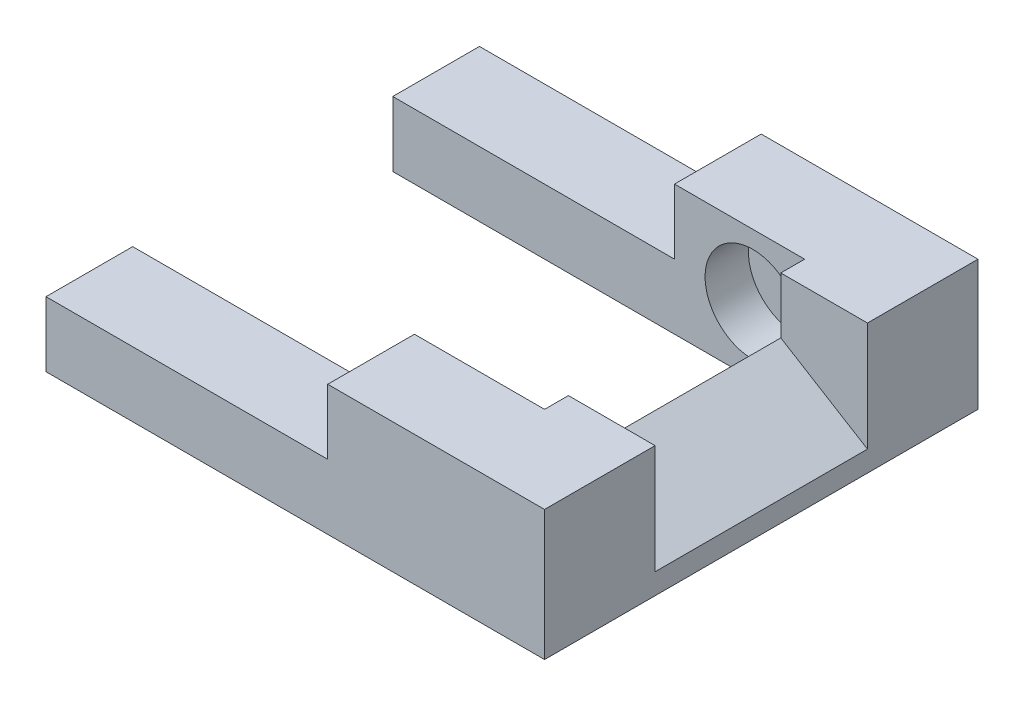
ISO-10303-21;
HEADER;
FILE_DESCRIPTION(('STEP AP214'),'2;1');
FILE_NAME('part.step','',(''),(''),'','','');
FILE_SCHEMA(('AUTOMOTIVE_DESIGN { 1 0 10303 214 1 1 1 1 }'));
ENDSEC;
DATA;
#1=APPLICATION_CONTEXT('core data for automotive mechanical design processes');
#2=APPLICATION_PROTOCOL_DEFINITION('international standard','automotive_design',2000,#1);
#3=PRODUCT_CONTEXT('',#1,'mechanical');
#4=PRODUCT('Part','Part','',(#3));
#5=PRODUCT_RELATED_PRODUCT_CATEGORY('part','',(#4));
#6=PRODUCT_DEFINITION_FORMATION('','',#4);
#7=PRODUCT_DEFINITION_CONTEXT('part definition',#1,'design');
#8=PRODUCT_DEFINITION('design','',#6,#7);
#9=PRODUCT_DEFINITION_SHAPE('','',#8);
#10=(LENGTH_UNIT() NAMED_UNIT(*) SI_UNIT(.MILLI.,.METRE.));
#11=(NAMED_UNIT(*) PLANE_ANGLE_UNIT() SI_UNIT($,.RADIAN.));
#12=(NAMED_UNIT(*) SI_UNIT($,.STERADIAN.) SOLID_ANGLE_UNIT());
#13=UNCERTAINTY_MEASURE_WITH_UNIT(LENGTH_MEASURE(1.E-05),#10,'distance_accuracy_value','');
#14=(GEOMETRIC_REPRESENTATION_CONTEXT(3) GLOBAL_UNCERTAINTY_ASSIGNED_CONTEXT((#13)) GLOBAL_UNIT_ASSIGNED_CONTEXT((#10,
#11,#12)) REPRESENTATION_CONTEXT('',''));
#15=CARTESIAN_POINT('',(0.,0.,0.));
#16=DIRECTION('',(0.,0.,1.));
#17=DIRECTION('',(1.,0.,0.));
#18=AXIS2_PLACEMENT_3D('',#15,#16,#17);
#19=CARTESIAN_POINT('',(0.,30.,0.));
#20=DIRECTION('',(0.,-1.,0.));
#21=DIRECTION('',(0.,0.,-1.));
#22=AXIS2_PLACEMENT_3D('',#19,#20,#21);
#23=PLANE('',#22);
#24=DIRECTION('',(-1.,0.,0.));
#25=VECTOR('',#24,1.);
#26=CARTESIAN_POINT('',(0.,30.,-54.5));
#27=LINE('',#26,#25);
#28=CARTESIAN_POINT('',(260.,30.,-54.5));
#29=VERTEX_POINT('',#28);
#30=CARTESIAN_POINT('',(240.,30.,-54.5));
#31=VERTEX_POINT('',#30);
#32=EDGE_CURVE('E227',#29,#31,#27,.T.);
#33=ORIENTED_EDGE('',*,*,#32,.F.);
#34=DIRECTION('',(0.,0.,-1.));
#35=VECTOR('',#34,1.);
#36=CARTESIAN_POINT('',(260.,30.,20.));
#37=LINE('',#36,#35);
#38=CARTESIAN_POINT('',(260.,30.,-80.));
#39=VERTEX_POINT('',#38);
#40=EDGE_CURVE('E281',#29,#39,#37,.T.);
#41=ORIENTED_EDGE('',*,*,#40,.T.);
#42=DIRECTION('',(-1.,0.,0.));
#43=VECTOR('',#42,1.);
#44=CARTESIAN_POINT('',(-20.,30.,-80.));
#45=LINE('',#44,#43);
#46=CARTESIAN_POINT('',(209.978221097427,30.,-80.));
#47=VERTEX_POINT('',#46);
#48=EDGE_CURVE('E183',#39,#47,#45,.T.);
#49=ORIENTED_EDGE('',*,*,#48,.T.);
#50=DIRECTION('',(0.,0.,1.));
#51=VECTOR('',#50,1.);
#52=CARTESIAN_POINT('',(209.978221097427,30.,-99.));
#53=LINE('',#52,#51);
#54=CARTESIAN_POINT('',(209.978221097427,30.,-60.));
#55=VERTEX_POINT('',#54);
#56=EDGE_CURVE('E243',#47,#55,#53,.T.);
#57=ORIENTED_EDGE('',*,*,#56,.T.);
#58=DIRECTION('',(-1.,0.,0.));
#59=VECTOR('',#58,1.);
#60=CARTESIAN_POINT('',(0.,30.,-59.9999999999999));
#61=LINE('',#60,#59);
#62=CARTESIAN_POINT('',(240.,30.,-60.));
#63=VERTEX_POINT('',#62);
#64=EDGE_CURVE('E271',#63,#55,#61,.T.);
#65=ORIENTED_EDGE('',*,*,#64,.F.);
#66=DIRECTION('',(0.,0.,-1.));
#67=VECTOR('',#66,1.);
#68=CARTESIAN_POINT('',(240.,30.,0.));
#69=LINE('',#68,#67);
#70=EDGE_CURVE('E268',#31,#63,#69,.T.);
#71=ORIENTED_EDGE('',*,*,#70,.F.);
#72=EDGE_LOOP('',(#33,#41,#49,#57,#65,#71));
#73=FACE_BOUND('',#72,.T.);
#74=ADVANCED_FACE('F36',(#73),#23,.F.);
#75=CARTESIAN_POINT('',(260.,30.,20.));
#76=DIRECTION('',(-1.,0.,0.));
#77=DIRECTION('',(0.,0.,1.));
#78=AXIS2_PLACEMENT_3D('',#75,#76,#77);
#79=PLANE('',#78);
#80=DIRECTION('',(0.,1.,0.));
#81=VECTOR('',#80,1.);
#82=CARTESIAN_POINT('',(260.,0.,-54.5));
#83=LINE('',#82,#81);
#84=CARTESIAN_POINT('',(260.,4.80107313806603,-54.5));
#85=VERTEX_POINT('',#84);
#86=EDGE_CURVE('E232',#85,#29,#83,.T.);
#87=ORIENTED_EDGE('',*,*,#86,.F.);
#88=DIRECTION('',(0.,0.,1.));
#89=VECTOR('',#88,1.);
#90=CARTESIAN_POINT('',(260.,4.80107313806603,-54.5));
#91=LINE('',#90,#89);
#92=CARTESIAN_POINT('',(260.,4.80107313806603,-5.49999999999998));
#93=VERTEX_POINT('',#92);
#94=EDGE_CURVE('E228',#85,#93,#91,.T.);
#95=ORIENTED_EDGE('',*,*,#94,.T.);
#96=DIRECTION('',(0.,1.,0.));
#97=VECTOR('',#96,1.);
#98=CARTESIAN_POINT('',(260.,0.,-5.49999999999998));
#99=LINE('',#98,#97);
#100=CARTESIAN_POINT('',(260.,30.,-5.49999999999998));
#101=VERTEX_POINT('',#100);
#102=EDGE_CURVE('E321',#93,#101,#99,.T.);
#103=ORIENTED_EDGE('',*,*,#102,.T.);
#104=CARTESIAN_POINT('',(260.,30.,20.));
#105=VERTEX_POINT('',#104);
#106=EDGE_CURVE('E226',#105,#101,#37,.T.);
#107=ORIENTED_EDGE('',*,*,#106,.F.);
#108=DIRECTION('',(0.,-1.,0.));
#109=VECTOR('',#108,1.);
#110=CARTESIAN_POINT('',(260.,30.,20.));
#111=LINE('',#110,#109);
#112=CARTESIAN_POINT('',(260.,0.,20.));
#113=VERTEX_POINT('',#112);
#114=EDGE_CURVE('E192',#105,#113,#111,.T.);
#115=ORIENTED_EDGE('',*,*,#114,.T.);
#116=DIRECTION('',(0.,0.,-1.));
#117=VECTOR('',#116,1.);
#118=CARTESIAN_POINT('',(260.,0.,20.));
#119=LINE('',#118,#117);
#120=CARTESIAN_POINT('',(260.,0.,-80.));
#121=VERTEX_POINT('',#120);
#122=EDGE_CURVE('E174',#113,#121,#119,.T.);
#123=ORIENTED_EDGE('',*,*,#122,.T.);
#124=DIRECTION('',(0.,-1.,0.));
#125=VECTOR('',#124,1.);
#126=CARTESIAN_POINT('',(260.,30.,-80.));
#127=LINE('',#126,#125);
#128=EDGE_CURVE('E189',#39,#121,#127,.T.);
#129=ORIENTED_EDGE('',*,*,#128,.F.);
#130=ORIENTED_EDGE('',*,*,#40,.F.);
#131=EDGE_LOOP('',(#87,#95,#103,#107,#115,#123,#129,#130));
#132=FACE_BOUND('',#131,.T.);
#133=ADVANCED_FACE('F292',(#132),#79,.F.);
#134=CARTESIAN_POINT('',(240.,30.,0.));
#135=DIRECTION('',(-1.,0.,0.));
#136=DIRECTION('',(0.,0.,1.));
#137=AXIS2_PLACEMENT_3D('',#134,#135,#136);
#138=PLANE('',#137);
#139=DIRECTION('',(0.,0.,1.));
#140=VECTOR('',#139,1.);
#141=CARTESIAN_POINT('',(240.,17.0214416943566,0.));
#142=LINE('',#141,#140);
#143=CARTESIAN_POINT('',(240.,17.0214416943566,-54.5));
#144=VERTEX_POINT('',#143);
#145=CARTESIAN_POINT('',(240.,17.0214416943566,-5.49999999999998));
#146=VERTEX_POINT('',#145);
#147=EDGE_CURVE('E44',#144,#146,#142,.T.);
#148=ORIENTED_EDGE('',*,*,#147,.F.);
#149=DIRECTION('',(0.,1.,0.));
#150=VECTOR('',#149,1.);
#151=CARTESIAN_POINT('',(240.,30.,-54.5));
#152=LINE('',#151,#150);
#153=EDGE_CURVE('E11',#144,#31,#152,.T.);
#154=ORIENTED_EDGE('',*,*,#153,.T.);
#155=ORIENTED_EDGE('',*,*,#70,.T.);
#156=DIRECTION('',(0.,-1.,0.));
#157=VECTOR('',#156,1.);
#158=CARTESIAN_POINT('',(240.,30.,-60.));
#159=LINE('',#158,#157);
#160=CARTESIAN_POINT('',(240.,0.,-60.));
#161=VERTEX_POINT('',#160);
#162=EDGE_CURVE('E180',#63,#161,#159,.T.);
#163=ORIENTED_EDGE('',*,*,#162,.T.);
#164=DIRECTION('',(0.,0.,-1.));
#165=VECTOR('',#164,1.);
#166=CARTESIAN_POINT('',(240.,0.,0.));
#167=LINE('',#166,#165);
#168=CARTESIAN_POINT('',(240.,0.,0.));
#169=VERTEX_POINT('',#168);
#170=EDGE_CURVE('E275',#169,#161,#167,.T.);
#171=ORIENTED_EDGE('',*,*,#170,.F.);
#172=DIRECTION('',(0.,-1.,0.));
#173=VECTOR('',#172,1.);
#174=CARTESIAN_POINT('',(240.,30.,0.));
#175=LINE('',#174,#173);
#176=CARTESIAN_POINT('',(240.,30.,0.));
#177=VERTEX_POINT('',#176);
#178=EDGE_CURVE('E175',#177,#169,#175,.T.);
#179=ORIENTED_EDGE('',*,*,#178,.F.);
#180=CARTESIAN_POINT('',(240.,30.,-5.49999999999998));
#181=VERTEX_POINT('',#180);
#182=EDGE_CURVE('E216',#177,#181,#69,.T.);
#183=ORIENTED_EDGE('',*,*,#182,.T.);
#184=DIRECTION('',(0.,1.,0.));
#185=VECTOR('',#184,1.);
#186=CARTESIAN_POINT('',(240.,30.,-5.49999999999998));
#187=LINE('',#186,#185);
#188=EDGE_CURVE('E203',#146,#181,#187,.T.);
#189=ORIENTED_EDGE('',*,*,#188,.F.);
#190=EDGE_LOOP('',(#148,#154,#155,#163,#171,#179,#183,#189));
#191=FACE_BOUND('',#190,.T.);
#192=ADVANCED_FACE('F213',(#191),#138,.T.);
#193=ORIENTED_EDGE('',*,*,#106,.T.);
#194=DIRECTION('',(-1.,0.,0.));
#195=VECTOR('',#194,1.);
#196=CARTESIAN_POINT('',(0.,30.,-5.49999999999998));
#197=LINE('',#196,#195);
#198=EDGE_CURVE('E219',#101,#181,#197,.T.);
#199=ORIENTED_EDGE('',*,*,#198,.T.);
#200=ORIENTED_EDGE('',*,*,#182,.F.);
#201=DIRECTION('',(1.,0.,0.));
#202=VECTOR('',#201,1.);
#203=CARTESIAN_POINT('',(0.,30.,0.));
#204=LINE('',#203,#202);
#205=CARTESIAN_POINT('',(209.978221097427,30.,0.));
#206=VERTEX_POINT('',#205);
#207=EDGE_CURVE('E266',#206,#177,#204,.T.);
#208=ORIENTED_EDGE('',*,*,#207,.F.);
#209=CARTESIAN_POINT('',(209.978221097427,30.,20.));
#210=VERTEX_POINT('',#209);
#211=EDGE_CURVE('E240',#206,#210,#53,.T.);
#212=ORIENTED_EDGE('',*,*,#211,.T.);
#213=DIRECTION('',(1.,0.,0.));
#214=VECTOR('',#213,1.);
#215=CARTESIAN_POINT('',(-20.,30.,20.));
#216=LINE('',#215,#214);
#217=EDGE_CURVE('E188',#210,#105,#216,.T.);
#218=ORIENTED_EDGE('',*,*,#217,.T.);
#219=EDGE_LOOP('',(#193,#199,#200,#208,#212,#218));
#220=FACE_BOUND('',#219,.T.);
#221=ADVANCED_FACE('F223',(#220),#23,.F.);
#222=CARTESIAN_POINT('',(0.,0.,0.));
#223=DIRECTION('',(0.,-1.,0.));
#224=DIRECTION('',(0.,0.,-1.));
#225=AXIS2_PLACEMENT_3D('',#222,#223,#224);
#226=PLANE('',#225);
#227=DIRECTION('',(0.,0.,1.));
#228=VECTOR('',#227,1.);
#229=CARTESIAN_POINT('',(144.978221097427,0.,0.));
#230=LINE('',#229,#228);
#231=CARTESIAN_POINT('',(144.978221097427,0.,-80.));
#232=VERTEX_POINT('',#231);
#233=CARTESIAN_POINT('',(144.978221097427,0.,-60.));
#234=VERTEX_POINT('',#233);
#235=EDGE_CURVE('E160',#232,#234,#230,.T.);
#236=ORIENTED_EDGE('',*,*,#235,.F.);
#237=DIRECTION('',(-1.,0.,0.));
#238=VECTOR('',#237,1.);
#239=CARTESIAN_POINT('',(-20.,0.,-80.));
#240=LINE('',#239,#238);
#241=EDGE_CURVE('E177',#121,#232,#240,.T.);
#242=ORIENTED_EDGE('',*,*,#241,.F.);
#243=ORIENTED_EDGE('',*,*,#122,.F.);
#244=DIRECTION('',(1.,0.,0.));
#245=VECTOR('',#244,1.);
#246=CARTESIAN_POINT('',(-20.,0.,20.));
#247=LINE('',#246,#245);
#248=CARTESIAN_POINT('',(144.978221097427,0.,20.));
#249=VERTEX_POINT('',#248);
#250=EDGE_CURVE('E164',#249,#113,#247,.T.);
#251=ORIENTED_EDGE('',*,*,#250,.F.);
#252=CARTESIAN_POINT('',(144.978221097427,0.,0.));
#253=VERTEX_POINT('',#252);
#254=EDGE_CURVE('E149',#253,#249,#230,.T.);
#255=ORIENTED_EDGE('',*,*,#254,.F.);
#256=DIRECTION('',(1.,0.,0.));
#257=VECTOR('',#256,1.);
#258=CARTESIAN_POINT('',(0.,0.,0.));
#259=LINE('',#258,#257);
#260=EDGE_CURVE('E265',#253,#169,#259,.T.);
#261=ORIENTED_EDGE('',*,*,#260,.T.);
#262=ORIENTED_EDGE('',*,*,#170,.T.);
#263=DIRECTION('',(-1.,0.,0.));
#264=VECTOR('',#263,1.);
#265=CARTESIAN_POINT('',(0.,0.,-59.9999999999999));
#266=LINE('',#265,#264);
#267=EDGE_CURVE('E269',#161,#234,#266,.T.);
#268=ORIENTED_EDGE('',*,*,#267,.T.);
#269=EDGE_LOOP('',(#236,#242,#243,#251,#255,#261,#262,#268));
#270=FACE_BOUND('',#269,.T.);
#271=ADVANCED_FACE('F172',(#270),#226,.T.);
#272=CARTESIAN_POINT('',(-20.,30.,20.));
#273=DIRECTION('',(0.,0.,-1.));
#274=DIRECTION('',(-1.,0.,0.));
#275=AXIS2_PLACEMENT_3D('',#272,#273,#274);
#276=PLANE('',#275);
#277=DIRECTION('',(1.,0.,0.));
#278=VECTOR('',#277,1.);
#279=CARTESIAN_POINT('',(144.978221097427,15.,20.));
#280=LINE('',#279,#278);
#281=CARTESIAN_POINT('',(144.978221097427,15.,20.));
#282=VERTEX_POINT('',#281);
#283=CARTESIAN_POINT('',(209.978221097427,15.,20.));
#284=VERTEX_POINT('',#283);
#285=EDGE_CURVE('E167',#282,#284,#280,.T.);
#286=ORIENTED_EDGE('',*,*,#285,.F.);
#287=DIRECTION('',(0.,1.,0.));
#288=VECTOR('',#287,1.);
#289=CARTESIAN_POINT('',(144.978221097427,-106.,20.));
#290=LINE('',#289,#288);
#291=EDGE_CURVE('E152',#249,#282,#290,.T.);
#292=ORIENTED_EDGE('',*,*,#291,.F.);
#293=ORIENTED_EDGE('',*,*,#250,.T.);
#294=ORIENTED_EDGE('',*,*,#114,.F.);
#295=ORIENTED_EDGE('',*,*,#217,.F.);
#296=DIRECTION('',(0.,1.,0.));
#297=VECTOR('',#296,1.);
#298=CARTESIAN_POINT('',(209.978221097427,15.,20.));
#299=LINE('',#298,#297);
#300=EDGE_CURVE('E237',#284,#210,#299,.T.);
#301=ORIENTED_EDGE('',*,*,#300,.F.);
#302=EDGE_LOOP('',(#286,#292,#293,#294,#295,#301));
#303=FACE_BOUND('',#302,.T.);
#304=ADVANCED_FACE('F38',(#303),#276,.F.);
#305=CARTESIAN_POINT('',(-20.,30.,-80.));
#306=DIRECTION('',(0.,0.,1.));
#307=DIRECTION('',(1.,0.,0.));
#308=AXIS2_PLACEMENT_3D('',#305,#306,#307);
#309=PLANE('',#308);
#310=ORIENTED_EDGE('',*,*,#241,.T.);
#311=DIRECTION('',(0.,1.,0.));
#312=VECTOR('',#311,1.);
#313=CARTESIAN_POINT('',(144.978221097427,30.,-80.));
#314=LINE('',#313,#312);
#315=CARTESIAN_POINT('',(144.978221097427,15.,-80.));
#316=VERTEX_POINT('',#315);
#317=EDGE_CURVE('E327',#232,#316,#314,.T.);
#318=ORIENTED_EDGE('',*,*,#317,.T.);
#319=DIRECTION('',(1.,0.,0.));
#320=VECTOR('',#319,1.);
#321=CARTESIAN_POINT('',(-20.,15.,-80.));
#322=LINE('',#321,#320);
#323=CARTESIAN_POINT('',(209.978221097427,15.,-80.));
#324=VERTEX_POINT('',#323);
#325=EDGE_CURVE('E250',#316,#324,#322,.T.);
#326=ORIENTED_EDGE('',*,*,#325,.T.);
#327=DIRECTION('',(0.,1.,0.));
#328=VECTOR('',#327,1.);
#329=CARTESIAN_POINT('',(209.978221097427,30.,-80.));
#330=LINE('',#329,#328);
#331=EDGE_CURVE('E255',#324,#47,#330,.T.);
#332=ORIENTED_EDGE('',*,*,#331,.T.);
#333=ORIENTED_EDGE('',*,*,#48,.F.);
#334=ORIENTED_EDGE('',*,*,#128,.T.);
#335=EDGE_LOOP('',(#310,#318,#326,#332,#333,#334));
#336=FACE_BOUND('',#335,.T.);
#337=ADVANCED_FACE('F294',(#336),#309,.F.);
#338=CARTESIAN_POINT('',(0.,30.,0.));
#339=DIRECTION('',(0.,0.,-1.));
#340=DIRECTION('',(-1.,0.,0.));
#341=AXIS2_PLACEMENT_3D('',#338,#339,#340);
#342=PLANE('',#341);
#343=DIRECTION('',(0.,-1.,0.));
#344=VECTOR('',#343,1.);
#345=CARTESIAN_POINT('',(144.978221097427,30.,0.));
#346=LINE('',#345,#344);
#347=CARTESIAN_POINT('',(144.978221097427,15.,0.));
#348=VERTEX_POINT('',#347);
#349=EDGE_CURVE('E155',#348,#253,#346,.T.);
#350=ORIENTED_EDGE('',*,*,#349,.F.);
#351=DIRECTION('',(-1.,0.,0.));
#352=VECTOR('',#351,1.);
#353=CARTESIAN_POINT('',(0.,15.,0.));
#354=LINE('',#353,#352);
#355=CARTESIAN_POINT('',(209.978221097427,15.,0.));
#356=VERTEX_POINT('',#355);
#357=EDGE_CURVE('E248',#356,#348,#354,.T.);
#358=ORIENTED_EDGE('',*,*,#357,.F.);
#359=DIRECTION('',(0.,-1.,0.));
#360=VECTOR('',#359,1.);
#361=CARTESIAN_POINT('',(209.978221097427,30.,0.));
#362=LINE('',#361,#360);
#363=EDGE_CURVE('E253',#206,#356,#362,.T.);
#364=ORIENTED_EDGE('',*,*,#363,.F.);
#365=ORIENTED_EDGE('',*,*,#207,.T.);
#366=ORIENTED_EDGE('',*,*,#178,.T.);
#367=ORIENTED_EDGE('',*,*,#260,.F.);
#368=EDGE_LOOP('',(#350,#358,#364,#365,#366,#367));
#369=FACE_BOUND('',#368,.T.);
#370=CARTESIAN_POINT('',(228.036930768266,15.,0.));
#371=DIRECTION('',(0.,0.,-1.));
#372=DIRECTION('',(-1.,0.,0.));
#373=AXIS2_PLACEMENT_3D('',#370,#371,#372);
#374=CIRCLE('',#373,11.);
#375=CARTESIAN_POINT('',(217.036930768266,15.,0.));
#376=VERTEX_POINT('',#375);
#377=EDGE_CURVE('E198',#376,#376,#374,.T.);
#378=ORIENTED_EDGE('',*,*,#377,.F.);
#379=EDGE_LOOP('',(#378));
#380=FACE_BOUND('',#379,.T.);
#381=ADVANCED_FACE('F315',(#369,#380),#342,.T.);
#382=CARTESIAN_POINT('',(0.,30.,-59.9999999999999));
#383=DIRECTION('',(0.,0.,1.));
#384=DIRECTION('',(1.,0.,0.));
#385=AXIS2_PLACEMENT_3D('',#382,#383,#384);
#386=PLANE('',#385);
#387=DIRECTION('',(0.,1.,0.));
#388=VECTOR('',#387,1.);
#389=CARTESIAN_POINT('',(144.978221097427,30.,-60.));
#390=LINE('',#389,#388);
#391=CARTESIAN_POINT('',(144.978221097427,15.,-60.));
#392=VERTEX_POINT('',#391);
#393=EDGE_CURVE('E168',#234,#392,#390,.T.);
#394=ORIENTED_EDGE('',*,*,#393,.F.);
#395=ORIENTED_EDGE('',*,*,#267,.F.);
#396=ORIENTED_EDGE('',*,*,#162,.F.);
#397=ORIENTED_EDGE('',*,*,#64,.T.);
#398=DIRECTION('',(0.,1.,0.));
#399=VECTOR('',#398,1.);
#400=CARTESIAN_POINT('',(209.978221097427,30.,-60.));
#401=LINE('',#400,#399);
#402=CARTESIAN_POINT('',(209.978221097427,15.,-60.));
#403=VERTEX_POINT('',#402);
#404=EDGE_CURVE('E201',#403,#55,#401,.T.);
#405=ORIENTED_EDGE('',*,*,#404,.F.);
#406=DIRECTION('',(1.,0.,0.));
#407=VECTOR('',#406,1.);
#408=CARTESIAN_POINT('',(0.,15.,-59.9999999999999));
#409=LINE('',#408,#407);
#410=EDGE_CURVE('E194',#392,#403,#409,.T.);
#411=ORIENTED_EDGE('',*,*,#410,.F.);
#412=EDGE_LOOP('',(#394,#395,#396,#397,#405,#411));
#413=FACE_BOUND('',#412,.T.);
#414=CARTESIAN_POINT('',(228.036930768266,15.,-60.));
#415=DIRECTION('',(0.,0.,1.));
#416=DIRECTION('',(1.,0.,0.));
#417=AXIS2_PLACEMENT_3D('',#414,#415,#416);
#418=CIRCLE('',#417,11.);
#419=CARTESIAN_POINT('',(239.036930768266,15.,-60.));
#420=VERTEX_POINT('',#419);
#421=EDGE_CURVE('E195',#420,#420,#418,.T.);
#422=ORIENTED_EDGE('',*,*,#421,.F.);
#423=EDGE_LOOP('',(#422));
#424=FACE_BOUND('',#423,.T.);
#425=ADVANCED_FACE('F308',(#413,#424),#386,.T.);
#426=CARTESIAN_POINT('',(228.036930768266,15.,-70.));
#427=DIRECTION('',(0.,0.,1.));
#428=DIRECTION('',(1.,0.,0.));
#429=AXIS2_PLACEMENT_3D('',#426,#427,#428);
#430=PLANE('',#429);
#431=CARTESIAN_POINT('',(228.036930768266,15.,-70.));
#432=DIRECTION('',(0.,0.,1.));
#433=DIRECTION('',(1.,0.,0.));
#434=AXIS2_PLACEMENT_3D('',#431,#432,#433);
#435=CIRCLE('',#434,11.);
#436=CARTESIAN_POINT('',(239.036930768266,15.,-70.));
#437=VERTEX_POINT('',#436);
#438=EDGE_CURVE('E199',#437,#437,#435,.T.);
#439=ORIENTED_EDGE('',*,*,#438,.T.);
#440=EDGE_LOOP('',(#439));
#441=FACE_BOUND('',#440,.T.);
#442=ADVANCED_FACE('F359',(#441),#430,.T.);
#443=CARTESIAN_POINT('',(228.036930768266,15.,-70.));
#444=DIRECTION('',(0.,0.,1.));
#445=DIRECTION('',(1.,0.,0.));
#446=AXIS2_PLACEMENT_3D('',#443,#444,#445);
#447=CYLINDRICAL_SURFACE('',#446,11.);
#448=ORIENTED_EDGE('',*,*,#421,.T.);
#449=EDGE_LOOP('',(#448));
#450=FACE_BOUND('',#449,.T.);
#451=ORIENTED_EDGE('',*,*,#438,.F.);
#452=EDGE_LOOP('',(#451));
#453=FACE_BOUND('',#452,.T.);
#454=ADVANCED_FACE('F456',(#450,#453),#447,.F.);
#455=ORIENTED_EDGE('',*,*,#377,.T.);
#456=EDGE_LOOP('',(#455));
#457=FACE_BOUND('',#456,.T.);
#458=CARTESIAN_POINT('',(228.036930768266,15.,10.));
#459=DIRECTION('',(0.,0.,1.));
#460=DIRECTION('',(1.,0.,0.));
#461=AXIS2_PLACEMENT_3D('',#458,#459,#460);
#462=CIRCLE('',#461,11.);
#463=CARTESIAN_POINT('',(239.036930768266,15.,10.));
#464=VERTEX_POINT('',#463);
#465=EDGE_CURVE('E258',#464,#464,#462,.T.);
#466=ORIENTED_EDGE('',*,*,#465,.T.);
#467=EDGE_LOOP('',(#466));
#468=FACE_BOUND('',#467,.T.);
#469=ADVANCED_FACE('F446',(#457,#468),#447,.F.);
#470=CARTESIAN_POINT('',(228.036930768266,15.,10.));
#471=DIRECTION('',(0.,0.,1.));
#472=DIRECTION('',(1.,0.,0.));
#473=AXIS2_PLACEMENT_3D('',#470,#471,#472);
#474=PLANE('',#473);
#475=ORIENTED_EDGE('',*,*,#465,.F.);
#476=EDGE_LOOP('',(#475));
#477=FACE_BOUND('',#476,.T.);
#478=ADVANCED_FACE('F441',(#477),#474,.F.);
#479=CARTESIAN_POINT('',(144.978221097427,15.,-99.));
#480=DIRECTION('',(0.,-1.,0.));
#481=DIRECTION('',(0.,0.,-1.));
#482=AXIS2_PLACEMENT_3D('',#479,#480,#481);
#483=PLANE('',#482);
#484=DIRECTION('',(0.,0.,1.));
#485=VECTOR('',#484,1.);
#486=CARTESIAN_POINT('',(144.978221097427,15.,-99.));
#487=LINE('',#486,#485);
#488=EDGE_CURVE('E246',#316,#392,#487,.T.);
#489=ORIENTED_EDGE('',*,*,#488,.T.);
#490=ORIENTED_EDGE('',*,*,#410,.T.);
#491=DIRECTION('',(0.,0.,1.));
#492=VECTOR('',#491,1.);
#493=CARTESIAN_POINT('',(209.978221097427,15.,-99.));
#494=LINE('',#493,#492);
#495=EDGE_CURVE('E244',#324,#403,#494,.T.);
#496=ORIENTED_EDGE('',*,*,#495,.F.);
#497=ORIENTED_EDGE('',*,*,#325,.F.);
#498=EDGE_LOOP('',(#489,#490,#496,#497));
#499=FACE_BOUND('',#498,.T.);
#500=ADVANCED_FACE('F304',(#499),#483,.F.);
#501=CARTESIAN_POINT('',(209.978221097427,15.,-99.));
#502=DIRECTION('',(1.,0.,0.));
#503=DIRECTION('',(0.,0.,-1.));
#504=AXIS2_PLACEMENT_3D('',#501,#502,#503);
#505=PLANE('',#504);
#506=ORIENTED_EDGE('',*,*,#495,.T.);
#507=ORIENTED_EDGE('',*,*,#404,.T.);
#508=ORIENTED_EDGE('',*,*,#56,.F.);
#509=ORIENTED_EDGE('',*,*,#331,.F.);
#510=EDGE_LOOP('',(#506,#507,#508,#509));
#511=FACE_BOUND('',#510,.T.);
#512=ADVANCED_FACE('F300',(#511),#505,.F.);
#513=ORIENTED_EDGE('',*,*,#363,.T.);
#514=EDGE_CURVE('E59',#356,#284,#494,.T.);
#515=ORIENTED_EDGE('',*,*,#514,.T.);
#516=ORIENTED_EDGE('',*,*,#300,.T.);
#517=ORIENTED_EDGE('',*,*,#211,.F.);
#518=EDGE_LOOP('',(#513,#515,#516,#517));
#519=FACE_BOUND('',#518,.T.);
#520=ADVANCED_FACE('F423',(#519),#505,.F.);
#521=ORIENTED_EDGE('',*,*,#357,.T.);
#522=EDGE_CURVE('E239',#348,#282,#487,.T.);
#523=ORIENTED_EDGE('',*,*,#522,.T.);
#524=ORIENTED_EDGE('',*,*,#285,.T.);
#525=ORIENTED_EDGE('',*,*,#514,.F.);
#526=EDGE_LOOP('',(#521,#523,#524,#525));
#527=FACE_BOUND('',#526,.T.);
#528=ADVANCED_FACE('F398',(#527),#483,.F.);
#529=CARTESIAN_POINT('',(0.,0.,-54.5));
#530=DIRECTION('',(0.,0.,1.));
#531=DIRECTION('',(1.,0.,0.));
#532=AXIS2_PLACEMENT_3D('',#529,#530,#531);
#533=PLANE('',#532);
#534=ORIENTED_EDGE('',*,*,#32,.T.);
#535=ORIENTED_EDGE('',*,*,#153,.F.);
#536=DIRECTION('',(0.8533170215302,-0.521392424922753,0.));
#537=VECTOR('',#536,1.);
#538=CARTESIAN_POINT('',(72.817075801686,119.173289195445,-54.5));
#539=LINE('',#538,#537);
#540=EDGE_CURVE('E210',#144,#85,#539,.T.);
#541=ORIENTED_EDGE('',*,*,#540,.T.);
#542=ORIENTED_EDGE('',*,*,#86,.T.);
#543=EDGE_LOOP('',(#534,#535,#541,#542));
#544=FACE_BOUND('',#543,.T.);
#545=ADVANCED_FACE('F390',(#544),#533,.T.);
#546=CARTESIAN_POINT('',(0.,0.,-5.49999999999998));
#547=DIRECTION('',(0.,0.,1.));
#548=DIRECTION('',(1.,0.,0.));
#549=AXIS2_PLACEMENT_3D('',#546,#547,#548);
#550=PLANE('',#549);
#551=ORIENTED_EDGE('',*,*,#102,.F.);
#552=DIRECTION('',(0.8533170215302,-0.521392424922753,0.));
#553=VECTOR('',#552,1.);
#554=CARTESIAN_POINT('',(72.817075801686,119.173289195445,-5.49999999999998));
#555=LINE('',#554,#553);
#556=EDGE_CURVE('E51',#146,#93,#555,.T.);
#557=ORIENTED_EDGE('',*,*,#556,.F.);
#558=ORIENTED_EDGE('',*,*,#188,.T.);
#559=ORIENTED_EDGE('',*,*,#198,.F.);
#560=EDGE_LOOP('',(#551,#557,#558,#559));
#561=FACE_BOUND('',#560,.T.);
#562=ADVANCED_FACE('F218',(#561),#550,.F.);
#563=CARTESIAN_POINT('',(72.817075801686,119.173289195445,-54.5));
#564=DIRECTION('',(-0.521392424922753,-0.8533170215302,0.));
#565=DIRECTION('',(0.8533170215302,-0.521392424922753,0.));
#566=AXIS2_PLACEMENT_3D('',#563,#564,#565);
#567=PLANE('',#566);
#568=ORIENTED_EDGE('',*,*,#147,.T.);
#569=ORIENTED_EDGE('',*,*,#556,.T.);
#570=ORIENTED_EDGE('',*,*,#94,.F.);
#571=ORIENTED_EDGE('',*,*,#540,.F.);
#572=EDGE_LOOP('',(#568,#569,#570,#571));
#573=FACE_BOUND('',#572,.T.);
#574=ADVANCED_FACE('F208',(#573),#567,.F.);
#575=CARTESIAN_POINT('',(144.978221097427,-106.,-84.6412720266648));
#576=DIRECTION('',(1.,0.,0.));
#577=DIRECTION('',(0.,0.,-1.));
#578=AXIS2_PLACEMENT_3D('',#575,#576,#577);
#579=PLANE('',#578);
#580=ORIENTED_EDGE('',*,*,#254,.T.);
#581=ORIENTED_EDGE('',*,*,#291,.T.);
#582=ORIENTED_EDGE('',*,*,#522,.F.);
#583=ORIENTED_EDGE('',*,*,#349,.T.);
#584=EDGE_LOOP('',(#580,#581,#582,#583));
#585=FACE_BOUND('',#584,.T.);
#586=ADVANCED_FACE('F151',(#585),#579,.F.);
#587=ORIENTED_EDGE('',*,*,#317,.F.);
#588=ORIENTED_EDGE('',*,*,#235,.T.);
#589=ORIENTED_EDGE('',*,*,#393,.T.);
#590=ORIENTED_EDGE('',*,*,#488,.F.);
#591=EDGE_LOOP('',(#587,#588,#589,#590));
#592=FACE_BOUND('',#591,.T.);
#593=ADVANCED_FACE('F330',(#592),#579,.F.);
#594=CLOSED_SHELL('',(#74,#133,#192,#221,#271,#304,#337,#381,#425,#442,#454,#469,#478,#500,#512,
#520,#528,#545,#562,#574,#586,#593));
#595=MANIFOLD_SOLID_BREP('B2',#594);
#596=ADVANCED_BREP_SHAPE_REPRESENTATION('',(#18,#595),#14);
#597=SHAPE_DEFINITION_REPRESENTATION(#9,#596);
ENDSEC;
END-ISO-10303-21;
